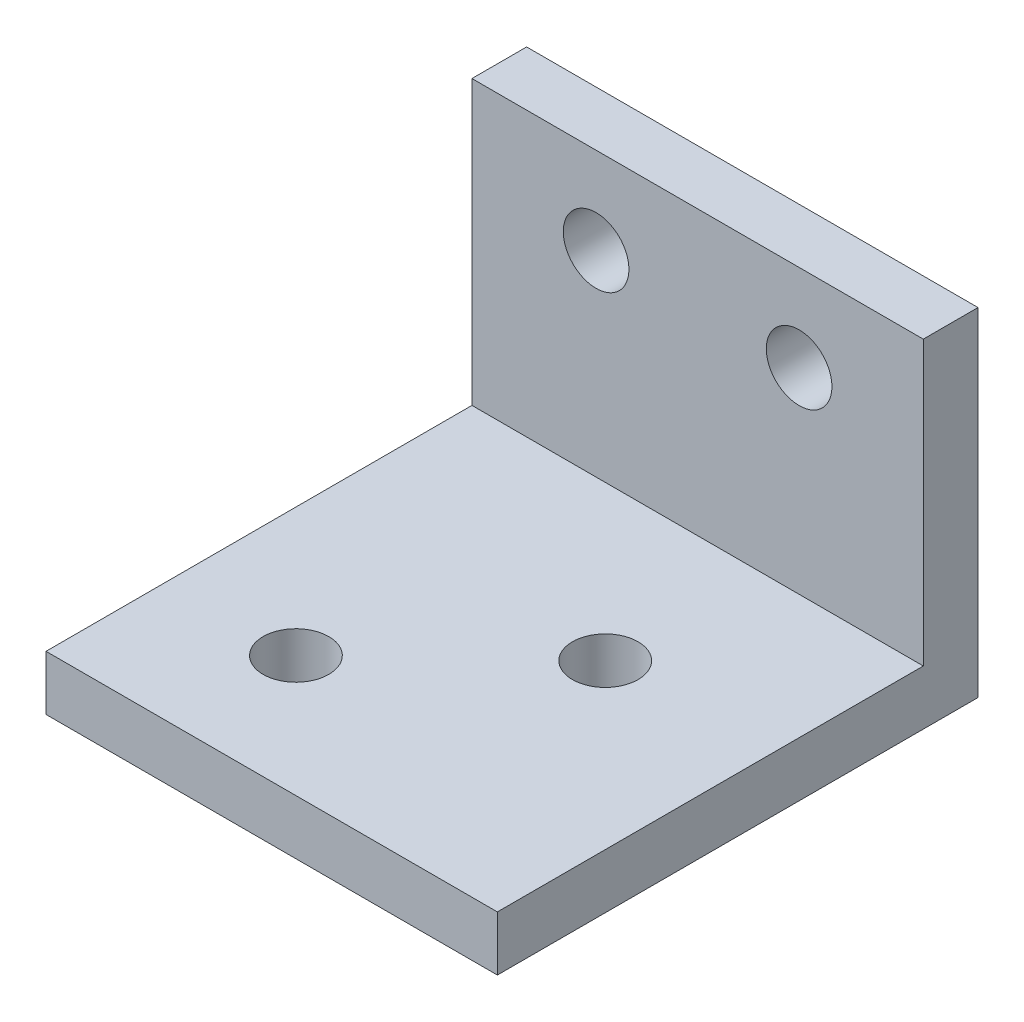
ISO-10303-21;
HEADER;
FILE_DESCRIPTION(('STEP AP214'),'2;1');
FILE_NAME('part.step','',(''),(''),'','','');
FILE_SCHEMA(('AUTOMOTIVE_DESIGN { 1 0 10303 214 1 1 1 1 }'));
ENDSEC;
DATA;
#1=APPLICATION_CONTEXT('core data for automotive mechanical design processes');
#2=APPLICATION_PROTOCOL_DEFINITION('international standard','automotive_design',2000,#1);
#3=PRODUCT_CONTEXT('',#1,'mechanical');
#4=PRODUCT('Part','Part','',(#3));
#5=PRODUCT_RELATED_PRODUCT_CATEGORY('part','',(#4));
#6=PRODUCT_DEFINITION_FORMATION('','',#4);
#7=PRODUCT_DEFINITION_CONTEXT('part definition',#1,'design');
#8=PRODUCT_DEFINITION('design','',#6,#7);
#9=PRODUCT_DEFINITION_SHAPE('','',#8);
#10=(LENGTH_UNIT() NAMED_UNIT(*) SI_UNIT(.MILLI.,.METRE.));
#11=(NAMED_UNIT(*) PLANE_ANGLE_UNIT() SI_UNIT($,.RADIAN.));
#12=(NAMED_UNIT(*) SI_UNIT($,.STERADIAN.) SOLID_ANGLE_UNIT());
#13=UNCERTAINTY_MEASURE_WITH_UNIT(LENGTH_MEASURE(1.E-05),#10,'distance_accuracy_value','');
#14=(GEOMETRIC_REPRESENTATION_CONTEXT(3) GLOBAL_UNCERTAINTY_ASSIGNED_CONTEXT((#13)) GLOBAL_UNIT_ASSIGNED_CONTEXT((#10,
#11,#12)) REPRESENTATION_CONTEXT('',''));
#15=CARTESIAN_POINT('',(0.,0.,0.));
#16=DIRECTION('',(0.,0.,1.));
#17=DIRECTION('',(1.,0.,0.));
#18=AXIS2_PLACEMENT_3D('',#15,#16,#17);
#19=CARTESIAN_POINT('',(0.,0.,5.));
#20=DIRECTION('',(0.,0.,-1.));
#21=DIRECTION('',(-1.,0.,0.));
#22=AXIS2_PLACEMENT_3D('',#19,#20,#21);
#23=PLANE('',#22);
#24=CARTESIAN_POINT('',(94.3666016856351,-27.5264544550084,5.));
#25=DIRECTION('',(0.,0.,1.));
#26=DIRECTION('',(1.,0.,0.));
#27=AXIS2_PLACEMENT_3D('',#24,#25,#26);
#28=CIRCLE('',#27,2.99999999999999);
#29=CARTESIAN_POINT('',(97.3666016856351,-27.5264544550084,5.));
#30=VERTEX_POINT('',#29);
#31=EDGE_CURVE('E103',#30,#30,#28,.T.);
#32=ORIENTED_EDGE('',*,*,#31,.F.);
#33=EDGE_LOOP('',(#32));
#34=FACE_BOUND('',#33,.T.);
#35=CARTESIAN_POINT('',(75.8110207440263,-27.5264544550084,5.));
#36=DIRECTION('',(0.,0.,1.));
#37=DIRECTION('',(1.,0.,0.));
#38=AXIS2_PLACEMENT_3D('',#35,#36,#37);
#39=CIRCLE('',#38,3.00000000000001);
#40=CARTESIAN_POINT('',(78.8110207440263,-27.5264544550084,5.));
#41=VERTEX_POINT('',#40);
#42=EDGE_CURVE('E97',#41,#41,#39,.T.);
#43=ORIENTED_EDGE('',*,*,#42,.F.);
#44=EDGE_LOOP('',(#43));
#45=FACE_BOUND('',#44,.T.);
#46=DIRECTION('',(-1.,0.,0.));
#47=VECTOR('',#46,1.);
#48=CARTESIAN_POINT('',(0.,-45.4640103245065,5.));
#49=LINE('',#48,#47);
#50=CARTESIAN_POINT('',(105.717216902766,-45.4640103245065,5.));
#51=VERTEX_POINT('',#50);
#52=CARTESIAN_POINT('',(64.4604055268956,-45.4640103245065,5.));
#53=VERTEX_POINT('',#52);
#54=EDGE_CURVE('E50',#51,#53,#49,.T.);
#55=ORIENTED_EDGE('',*,*,#54,.F.);
#56=DIRECTION('',(0.,1.,0.));
#57=VECTOR('',#56,1.);
#58=CARTESIAN_POINT('',(105.717216902766,-35.4640103245065,5.));
#59=LINE('',#58,#57);
#60=CARTESIAN_POINT('',(105.717216902766,-19.5888985855103,5.));
#61=VERTEX_POINT('',#60);
#62=EDGE_CURVE('E92',#51,#61,#59,.T.);
#63=ORIENTED_EDGE('',*,*,#62,.T.);
#64=DIRECTION('',(-1.,0.,0.));
#65=VECTOR('',#64,1.);
#66=CARTESIAN_POINT('',(64.4604055268956,-19.5888985855102,5.));
#67=LINE('',#66,#65);
#68=CARTESIAN_POINT('',(64.4604055268956,-19.5888985855102,5.));
#69=VERTEX_POINT('',#68);
#70=EDGE_CURVE('E56',#61,#69,#67,.T.);
#71=ORIENTED_EDGE('',*,*,#70,.T.);
#72=DIRECTION('',(0.,-1.,0.));
#73=VECTOR('',#72,1.);
#74=CARTESIAN_POINT('',(64.4604055268956,-35.4640103245065,5.));
#75=LINE('',#74,#73);
#76=EDGE_CURVE('E86',#69,#53,#75,.T.);
#77=ORIENTED_EDGE('',*,*,#76,.T.);
#78=EDGE_LOOP('',(#55,#63,#71,#77));
#79=FACE_BOUND('',#78,.T.);
#80=ADVANCED_FACE('F35',(#34,#45,#79),#23,.F.);
#81=CARTESIAN_POINT('',(0.,0.,0.));
#82=DIRECTION('',(0.,0.,-1.));
#83=DIRECTION('',(-1.,0.,0.));
#84=AXIS2_PLACEMENT_3D('',#81,#82,#83);
#85=PLANE('',#84);
#86=CARTESIAN_POINT('',(75.8110207440263,-27.5264544550084,0.));
#87=DIRECTION('',(0.,0.,1.));
#88=DIRECTION('',(1.,0.,0.));
#89=AXIS2_PLACEMENT_3D('',#86,#87,#88);
#90=CIRCLE('',#89,3.00000000000001);
#91=CARTESIAN_POINT('',(78.8110207440263,-27.5264544550084,0.));
#92=VERTEX_POINT('',#91);
#93=EDGE_CURVE('E100',#92,#92,#90,.T.);
#94=ORIENTED_EDGE('',*,*,#93,.T.);
#95=EDGE_LOOP('',(#94));
#96=FACE_BOUND('',#95,.T.);
#97=DIRECTION('',(0.,1.,0.));
#98=VECTOR('',#97,1.);
#99=CARTESIAN_POINT('',(105.717216902766,-35.4640103245065,0.));
#100=LINE('',#99,#98);
#101=CARTESIAN_POINT('',(105.717216902766,-50.4640103245065,0.));
#102=VERTEX_POINT('',#101);
#103=CARTESIAN_POINT('',(105.717216902766,-19.5888985855103,0.));
#104=VERTEX_POINT('',#103);
#105=EDGE_CURVE('E77',#102,#104,#100,.T.);
#106=ORIENTED_EDGE('',*,*,#105,.F.);
#107=DIRECTION('',(1.,0.,0.));
#108=VECTOR('',#107,1.);
#109=CARTESIAN_POINT('',(64.4604055268956,-50.4640103245065,0.));
#110=LINE('',#109,#108);
#111=CARTESIAN_POINT('',(64.4604055268956,-50.4640103245065,0.));
#112=VERTEX_POINT('',#111);
#113=EDGE_CURVE('E91',#112,#102,#110,.T.);
#114=ORIENTED_EDGE('',*,*,#113,.F.);
#115=DIRECTION('',(0.,-1.,0.));
#116=VECTOR('',#115,1.);
#117=CARTESIAN_POINT('',(64.4604055268956,-35.4640103245065,0.));
#118=LINE('',#117,#116);
#119=CARTESIAN_POINT('',(64.4604055268956,-19.5888985855102,0.));
#120=VERTEX_POINT('',#119);
#121=EDGE_CURVE('E76',#120,#112,#118,.T.);
#122=ORIENTED_EDGE('',*,*,#121,.F.);
#123=DIRECTION('',(-1.,0.,0.));
#124=VECTOR('',#123,1.);
#125=CARTESIAN_POINT('',(64.4604055268956,-19.5888985855102,0.));
#126=LINE('',#125,#124);
#127=EDGE_CURVE('E67',#104,#120,#126,.T.);
#128=ORIENTED_EDGE('',*,*,#127,.F.);
#129=EDGE_LOOP('',(#106,#114,#122,#128));
#130=FACE_BOUND('',#129,.T.);
#131=CARTESIAN_POINT('',(94.3666016856351,-27.5264544550084,0.));
#132=DIRECTION('',(0.,0.,1.));
#133=DIRECTION('',(1.,0.,0.));
#134=AXIS2_PLACEMENT_3D('',#131,#132,#133);
#135=CIRCLE('',#134,2.99999999999999);
#136=CARTESIAN_POINT('',(97.3666016856351,-27.5264544550084,0.));
#137=VERTEX_POINT('',#136);
#138=EDGE_CURVE('E106',#137,#137,#135,.T.);
#139=ORIENTED_EDGE('',*,*,#138,.T.);
#140=EDGE_LOOP('',(#139));
#141=FACE_BOUND('',#140,.T.);
#142=ADVANCED_FACE('F88',(#96,#130,#141),#85,.T.);
#143=CARTESIAN_POINT('',(105.717216902766,-35.4640103245065,5.));
#144=DIRECTION('',(-1.,0.,0.));
#145=DIRECTION('',(0.,0.,1.));
#146=AXIS2_PLACEMENT_3D('',#143,#144,#145);
#147=PLANE('',#146);
#148=ORIENTED_EDGE('',*,*,#105,.T.);
#149=DIRECTION('',(0.,0.,-1.));
#150=VECTOR('',#149,1.);
#151=CARTESIAN_POINT('',(105.717216902766,-19.5888985855103,5.));
#152=LINE('',#151,#150);
#153=EDGE_CURVE('E11',#61,#104,#152,.T.);
#154=ORIENTED_EDGE('',*,*,#153,.F.);
#155=ORIENTED_EDGE('',*,*,#62,.F.);
#156=DIRECTION('',(0.,0.,1.));
#157=VECTOR('',#156,1.);
#158=CARTESIAN_POINT('',(105.717216902766,-45.4640103245065,0.));
#159=LINE('',#158,#157);
#160=CARTESIAN_POINT('',(105.717216902766,-45.4640103245065,43.9312426131457));
#161=VERTEX_POINT('',#160);
#162=EDGE_CURVE('E142',#51,#161,#159,.T.);
#163=ORIENTED_EDGE('',*,*,#162,.T.);
#164=DIRECTION('',(0.,-1.,0.));
#165=VECTOR('',#164,1.);
#166=CARTESIAN_POINT('',(105.717216902766,-45.4640103245065,43.9312426131457));
#167=LINE('',#166,#165);
#168=CARTESIAN_POINT('',(105.717216902766,-50.4640103245065,43.9312426131457));
#169=VERTEX_POINT('',#168);
#170=EDGE_CURVE('E118',#161,#169,#167,.T.);
#171=ORIENTED_EDGE('',*,*,#170,.T.);
#172=DIRECTION('',(0.,0.,1.));
#173=VECTOR('',#172,1.);
#174=CARTESIAN_POINT('',(105.717216902766,-50.4640103245065,0.));
#175=LINE('',#174,#173);
#176=EDGE_CURVE('E109',#102,#169,#175,.T.);
#177=ORIENTED_EDGE('',*,*,#176,.F.);
#178=EDGE_LOOP('',(#148,#154,#155,#163,#171,#177));
#179=FACE_BOUND('',#178,.T.);
#180=ADVANCED_FACE('F37',(#179),#147,.F.);
#181=CARTESIAN_POINT('',(64.4604055268956,-19.5888985855102,5.));
#182=DIRECTION('',(0.,-1.,0.));
#183=DIRECTION('',(1.,0.,0.));
#184=AXIS2_PLACEMENT_3D('',#181,#182,#183);
#185=PLANE('',#184);
#186=ORIENTED_EDGE('',*,*,#127,.T.);
#187=DIRECTION('',(0.,0.,-1.));
#188=VECTOR('',#187,1.);
#189=CARTESIAN_POINT('',(64.4604055268956,-19.5888985855102,5.));
#190=LINE('',#189,#188);
#191=EDGE_CURVE('E43',#69,#120,#190,.T.);
#192=ORIENTED_EDGE('',*,*,#191,.F.);
#193=ORIENTED_EDGE('',*,*,#70,.F.);
#194=ORIENTED_EDGE('',*,*,#153,.T.);
#195=EDGE_LOOP('',(#186,#192,#193,#194));
#196=FACE_BOUND('',#195,.T.);
#197=ADVANCED_FACE('F69',(#196),#185,.F.);
#198=CARTESIAN_POINT('',(64.4604055268956,-35.4640103245065,5.));
#199=DIRECTION('',(1.,0.,0.));
#200=DIRECTION('',(0.,0.,-1.));
#201=AXIS2_PLACEMENT_3D('',#198,#199,#200);
#202=PLANE('',#201);
#203=ORIENTED_EDGE('',*,*,#121,.T.);
#204=DIRECTION('',(0.,0.,1.));
#205=VECTOR('',#204,1.);
#206=CARTESIAN_POINT('',(64.4604055268956,-50.4640103245065,0.));
#207=LINE('',#206,#205);
#208=CARTESIAN_POINT('',(64.4604055268956,-50.4640103245065,43.9312426131457));
#209=VERTEX_POINT('',#208);
#210=EDGE_CURVE('E112',#112,#209,#207,.T.);
#211=ORIENTED_EDGE('',*,*,#210,.T.);
#212=DIRECTION('',(0.,-1.,0.));
#213=VECTOR('',#212,1.);
#214=CARTESIAN_POINT('',(64.4604055268956,-45.4640103245065,43.9312426131457));
#215=LINE('',#214,#213);
#216=CARTESIAN_POINT('',(64.4604055268956,-45.4640103245065,43.9312426131457));
#217=VERTEX_POINT('',#216);
#218=EDGE_CURVE('E117',#217,#209,#215,.T.);
#219=ORIENTED_EDGE('',*,*,#218,.F.);
#220=DIRECTION('',(0.,0.,1.));
#221=VECTOR('',#220,1.);
#222=CARTESIAN_POINT('',(64.4604055268956,-45.4640103245065,0.));
#223=LINE('',#222,#221);
#224=EDGE_CURVE('E127',#53,#217,#223,.T.);
#225=ORIENTED_EDGE('',*,*,#224,.F.);
#226=ORIENTED_EDGE('',*,*,#76,.F.);
#227=ORIENTED_EDGE('',*,*,#191,.T.);
#228=EDGE_LOOP('',(#203,#211,#219,#225,#226,#227));
#229=FACE_BOUND('',#228,.T.);
#230=ADVANCED_FACE('F81',(#229),#202,.F.);
#231=CARTESIAN_POINT('',(75.8110207440263,-27.5264544550084,5.));
#232=DIRECTION('',(0.,0.,-1.));
#233=DIRECTION('',(-1.,0.,0.));
#234=AXIS2_PLACEMENT_3D('',#231,#232,#233);
#235=CYLINDRICAL_SURFACE('',#234,3.00000000000001);
#236=ORIENTED_EDGE('',*,*,#42,.T.);
#237=EDGE_LOOP('',(#236));
#238=FACE_BOUND('',#237,.T.);
#239=ORIENTED_EDGE('',*,*,#93,.F.);
#240=EDGE_LOOP('',(#239));
#241=FACE_BOUND('',#240,.T.);
#242=ADVANCED_FACE('F177',(#238,#241),#235,.F.);
#243=CARTESIAN_POINT('',(94.3666016856351,-27.5264544550084,5.));
#244=DIRECTION('',(0.,0.,-1.));
#245=DIRECTION('',(-1.,0.,0.));
#246=AXIS2_PLACEMENT_3D('',#243,#244,#245);
#247=CYLINDRICAL_SURFACE('',#246,2.99999999999999);
#248=ORIENTED_EDGE('',*,*,#31,.T.);
#249=EDGE_LOOP('',(#248));
#250=FACE_BOUND('',#249,.T.);
#251=ORIENTED_EDGE('',*,*,#138,.F.);
#252=EDGE_LOOP('',(#251));
#253=FACE_BOUND('',#252,.T.);
#254=ADVANCED_FACE('F200',(#250,#253),#247,.F.);
#255=CARTESIAN_POINT('',(64.4604055268956,-50.4640103245065,0.));
#256=DIRECTION('',(0.,-1.,0.));
#257=DIRECTION('',(0.,0.,-1.));
#258=AXIS2_PLACEMENT_3D('',#255,#256,#257);
#259=PLANE('',#258);
#260=ORIENTED_EDGE('',*,*,#176,.T.);
#261=DIRECTION('',(-1.,0.,0.));
#262=VECTOR('',#261,1.);
#263=CARTESIAN_POINT('',(0.,-50.4640103245065,43.9312426131457));
#264=LINE('',#263,#262);
#265=EDGE_CURVE('E131',#169,#209,#264,.T.);
#266=ORIENTED_EDGE('',*,*,#265,.T.);
#267=ORIENTED_EDGE('',*,*,#210,.F.);
#268=ORIENTED_EDGE('',*,*,#113,.T.);
#269=EDGE_LOOP('',(#260,#266,#267,#268));
#270=FACE_BOUND('',#269,.T.);
#271=CARTESIAN_POINT('',(76.2138487255197,-50.4640103245065,32.8403188736275));
#272=DIRECTION('',(0.,-1.,0.));
#273=DIRECTION('',(0.,0.,-1.));
#274=AXIS2_PLACEMENT_3D('',#271,#272,#273);
#275=CIRCLE('',#274,3.00000000000001);
#276=CARTESIAN_POINT('',(76.2138487255197,-50.4640103245065,29.8403188736275));
#277=VERTEX_POINT('',#276);
#278=EDGE_CURVE('E128',#277,#277,#275,.T.);
#279=ORIENTED_EDGE('',*,*,#278,.F.);
#280=EDGE_LOOP('',(#279));
#281=FACE_BOUND('',#280,.T.);
#282=CARTESIAN_POINT('',(90.7600106173783,-50.4640103245065,19.1140967343846));
#283=DIRECTION('',(0.,-1.,0.));
#284=DIRECTION('',(0.,0.,-1.));
#285=AXIS2_PLACEMENT_3D('',#282,#283,#284);
#286=CIRCLE('',#285,3.00000000000001);
#287=CARTESIAN_POINT('',(90.7600106173783,-50.4640103245065,16.1140967343846));
#288=VERTEX_POINT('',#287);
#289=EDGE_CURVE('E124',#288,#288,#286,.F.);
#290=ORIENTED_EDGE('',*,*,#289,.T.);
#291=EDGE_LOOP('',(#290));
#292=FACE_BOUND('',#291,.T.);
#293=ADVANCED_FACE('F227',(#270,#281,#292),#259,.T.);
#294=CARTESIAN_POINT('',(0.,-45.4640103245065,43.9312426131457));
#295=DIRECTION('',(0.,0.,1.));
#296=DIRECTION('',(1.,0.,0.));
#297=AXIS2_PLACEMENT_3D('',#294,#295,#296);
#298=PLANE('',#297);
#299=ORIENTED_EDGE('',*,*,#265,.F.);
#300=ORIENTED_EDGE('',*,*,#170,.F.);
#301=DIRECTION('',(-1.,0.,0.));
#302=VECTOR('',#301,1.);
#303=CARTESIAN_POINT('',(0.,-45.4640103245065,43.9312426131457));
#304=LINE('',#303,#302);
#305=EDGE_CURVE('E139',#161,#217,#304,.T.);
#306=ORIENTED_EDGE('',*,*,#305,.T.);
#307=ORIENTED_EDGE('',*,*,#218,.T.);
#308=EDGE_LOOP('',(#299,#300,#306,#307));
#309=FACE_BOUND('',#308,.T.);
#310=ADVANCED_FACE('F161',(#309),#298,.T.);
#311=CARTESIAN_POINT('',(76.2138487255197,-45.4640103245065,32.8403188736275));
#312=DIRECTION('',(0.,-1.,0.));
#313=DIRECTION('',(0.,0.,-1.));
#314=AXIS2_PLACEMENT_3D('',#311,#312,#313);
#315=CYLINDRICAL_SURFACE('',#314,3.00000000000001);
#316=CARTESIAN_POINT('',(76.2138487255197,-45.4640103245065,32.8403188736275));
#317=DIRECTION('',(0.,-1.,0.));
#318=DIRECTION('',(0.,0.,-1.));
#319=AXIS2_PLACEMENT_3D('',#316,#317,#318);
#320=CIRCLE('',#319,3.00000000000001);
#321=CARTESIAN_POINT('',(76.2138487255197,-45.4640103245065,29.8403188736275));
#322=VERTEX_POINT('',#321);
#323=EDGE_CURVE('E136',#322,#322,#320,.T.);
#324=ORIENTED_EDGE('',*,*,#323,.F.);
#325=EDGE_LOOP('',(#324));
#326=FACE_BOUND('',#325,.T.);
#327=ORIENTED_EDGE('',*,*,#278,.T.);
#328=EDGE_LOOP('',(#327));
#329=FACE_BOUND('',#328,.T.);
#330=ADVANCED_FACE('F245',(#326,#329),#315,.F.);
#331=CARTESIAN_POINT('',(90.7600106173783,-45.4640103245065,19.1140967343846));
#332=DIRECTION('',(0.,-1.,0.));
#333=DIRECTION('',(0.,0.,-1.));
#334=AXIS2_PLACEMENT_3D('',#331,#332,#333);
#335=CYLINDRICAL_SURFACE('',#334,3.00000000000001);
#336=CARTESIAN_POINT('',(90.7600106173783,-45.4640103245065,19.1140967343846));
#337=DIRECTION('',(0.,-1.,0.));
#338=DIRECTION('',(0.,0.,-1.));
#339=AXIS2_PLACEMENT_3D('',#336,#337,#338);
#340=CIRCLE('',#339,3.00000000000001);
#341=CARTESIAN_POINT('',(90.7600106173783,-45.4640103245065,16.1140967343846));
#342=VERTEX_POINT('',#341);
#343=EDGE_CURVE('E121',#342,#342,#340,.F.);
#344=ORIENTED_EDGE('',*,*,#343,.T.);
#345=EDGE_LOOP('',(#344));
#346=FACE_BOUND('',#345,.T.);
#347=ORIENTED_EDGE('',*,*,#289,.F.);
#348=EDGE_LOOP('',(#347));
#349=FACE_BOUND('',#348,.T.);
#350=ADVANCED_FACE('F253',(#346,#349),#335,.F.);
#351=CARTESIAN_POINT('',(0.,-45.4640103245065,0.));
#352=DIRECTION('',(0.,-1.,0.));
#353=DIRECTION('',(0.,0.,-1.));
#354=AXIS2_PLACEMENT_3D('',#351,#352,#353);
#355=PLANE('',#354);
#356=ORIENTED_EDGE('',*,*,#224,.T.);
#357=ORIENTED_EDGE('',*,*,#305,.F.);
#358=ORIENTED_EDGE('',*,*,#162,.F.);
#359=ORIENTED_EDGE('',*,*,#54,.T.);
#360=EDGE_LOOP('',(#356,#357,#358,#359));
#361=FACE_BOUND('',#360,.T.);
#362=ORIENTED_EDGE('',*,*,#323,.T.);
#363=EDGE_LOOP('',(#362));
#364=FACE_BOUND('',#363,.T.);
#365=ORIENTED_EDGE('',*,*,#343,.F.);
#366=EDGE_LOOP('',(#365));
#367=FACE_BOUND('',#366,.T.);
#368=ADVANCED_FACE('F151',(#361,#364,#367),#355,.F.);
#369=CLOSED_SHELL('',(#80,#142,#180,#197,#230,#242,#254,#293,#310,#330,#350,#368));
#370=MANIFOLD_SOLID_BREP('B2',#369);
#371=ADVANCED_BREP_SHAPE_REPRESENTATION('',(#18,#370),#14);
#372=SHAPE_DEFINITION_REPRESENTATION(#9,#371);
ENDSEC;
END-ISO-10303-21;
